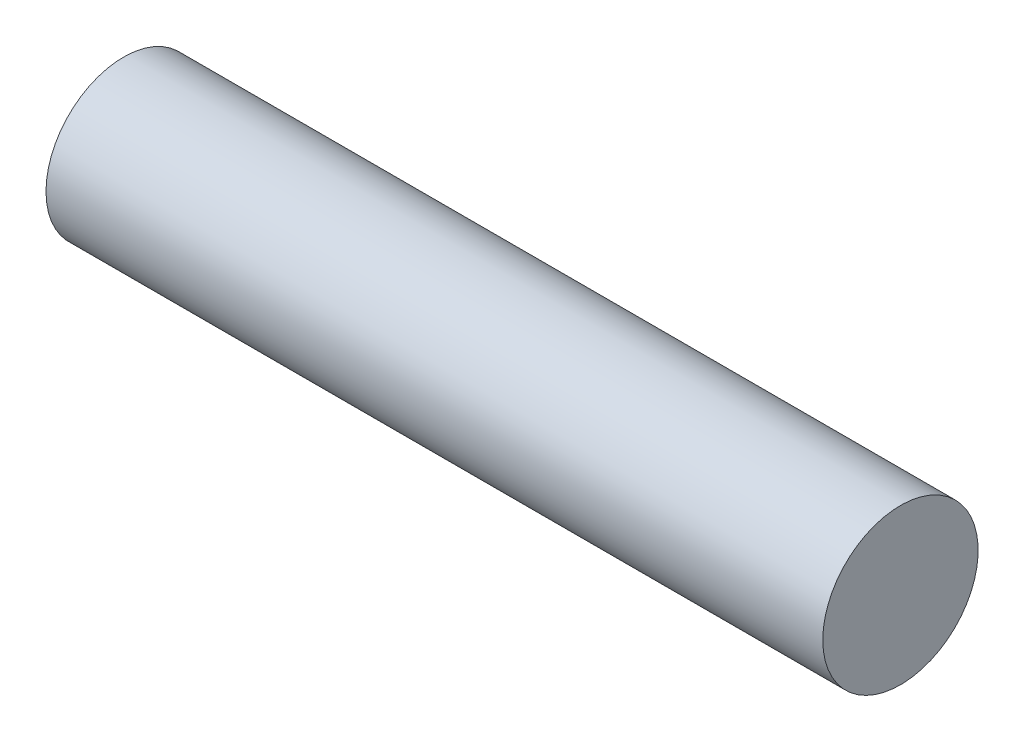
ISO-10303-21;
HEADER;
FILE_DESCRIPTION(('STEP AP214'),'2;1');
FILE_NAME('part.step','',(''),(''),'','','');
FILE_SCHEMA(('AUTOMOTIVE_DESIGN { 1 0 10303 214 1 1 1 1 }'));
ENDSEC;
DATA;
#1=APPLICATION_CONTEXT('core data for automotive mechanical design processes');
#2=APPLICATION_PROTOCOL_DEFINITION('international standard','automotive_design',2000,#1);
#3=PRODUCT_CONTEXT('',#1,'mechanical');
#4=PRODUCT('Part','Part','',(#3));
#5=PRODUCT_RELATED_PRODUCT_CATEGORY('part','',(#4));
#6=PRODUCT_DEFINITION_FORMATION('','',#4);
#7=PRODUCT_DEFINITION_CONTEXT('part definition',#1,'design');
#8=PRODUCT_DEFINITION('design','',#6,#7);
#9=PRODUCT_DEFINITION_SHAPE('','',#8);
#10=(LENGTH_UNIT() NAMED_UNIT(*) SI_UNIT(.MILLI.,.METRE.));
#11=(NAMED_UNIT(*) PLANE_ANGLE_UNIT() SI_UNIT($,.RADIAN.));
#12=(NAMED_UNIT(*) SI_UNIT($,.STERADIAN.) SOLID_ANGLE_UNIT());
#13=UNCERTAINTY_MEASURE_WITH_UNIT(LENGTH_MEASURE(1.E-05),#10,'distance_accuracy_value','');
#14=(GEOMETRIC_REPRESENTATION_CONTEXT(3) GLOBAL_UNCERTAINTY_ASSIGNED_CONTEXT((#13)) GLOBAL_UNIT_ASSIGNED_CONTEXT((#10,
#11,#12)) REPRESENTATION_CONTEXT('',''));
#15=CARTESIAN_POINT('',(0.,0.,0.));
#16=DIRECTION('',(0.,0.,1.));
#17=DIRECTION('',(1.,0.,0.));
#18=AXIS2_PLACEMENT_3D('',#15,#16,#17);
#19=CARTESIAN_POINT('',(0.,30.,0.));
#20=DIRECTION('',(1.,0.,0.));
#21=DIRECTION('',(0.,0.,-1.));
#22=AXIS2_PLACEMENT_3D('',#19,#20,#21);
#23=PLANE('',#22);
#24=CARTESIAN_POINT('',(0.,0.,0.));
#25=DIRECTION('',(-1.,0.,0.));
#26=DIRECTION('',(0.,0.,1.));
#27=AXIS2_PLACEMENT_3D('',#24,#25,#26);
#28=CIRCLE('',#27,30.);
#29=CARTESIAN_POINT('',(0.,0.,30.));
#30=VERTEX_POINT('',#29);
#31=EDGE_CURVE('E46',#30,#30,#28,.T.);
#32=ORIENTED_EDGE('',*,*,#31,.T.);
#33=EDGE_LOOP('',(#32));
#34=FACE_BOUND('',#33,.T.);
#35=ADVANCED_FACE('F39',(#34),#23,.F.);
#36=CARTESIAN_POINT('',(300.,0.,0.));
#37=DIRECTION('',(-1.,0.,0.));
#38=DIRECTION('',(0.,0.,1.));
#39=AXIS2_PLACEMENT_3D('',#36,#37,#38);
#40=PLANE('',#39);
#41=CARTESIAN_POINT('',(300.,0.,0.));
#42=DIRECTION('',(-1.,0.,0.));
#43=DIRECTION('',(0.,0.,1.));
#44=AXIS2_PLACEMENT_3D('',#41,#42,#43);
#45=CIRCLE('',#44,30.);
#46=CARTESIAN_POINT('',(300.,0.,30.));
#47=VERTEX_POINT('',#46);
#48=EDGE_CURVE('E10',#47,#47,#45,.T.);
#49=ORIENTED_EDGE('',*,*,#48,.F.);
#50=EDGE_LOOP('',(#49));
#51=FACE_BOUND('',#50,.T.);
#52=ADVANCED_FACE('F60',(#51),#40,.F.);
#53=CARTESIAN_POINT('',(0.,0.,0.));
#54=DIRECTION('',(-1.,0.,0.));
#55=DIRECTION('',(0.,0.,1.));
#56=AXIS2_PLACEMENT_3D('',#53,#54,#55);
#57=CYLINDRICAL_SURFACE('',#56,30.);
#58=ORIENTED_EDGE('',*,*,#31,.F.);
#59=EDGE_LOOP('',(#58));
#60=FACE_BOUND('',#59,.T.);
#61=ORIENTED_EDGE('',*,*,#48,.T.);
#62=EDGE_LOOP('',(#61));
#63=FACE_BOUND('',#62,.T.);
#64=ADVANCED_FACE('F58',(#60,#63),#57,.T.);
#65=CLOSED_SHELL('',(#35,#52,#64));
#66=MANIFOLD_SOLID_BREP('B2',#65);
#67=ADVANCED_BREP_SHAPE_REPRESENTATION('',(#18,#66),#14);
#68=SHAPE_DEFINITION_REPRESENTATION(#9,#67);
ENDSEC;
END-ISO-10303-21;
